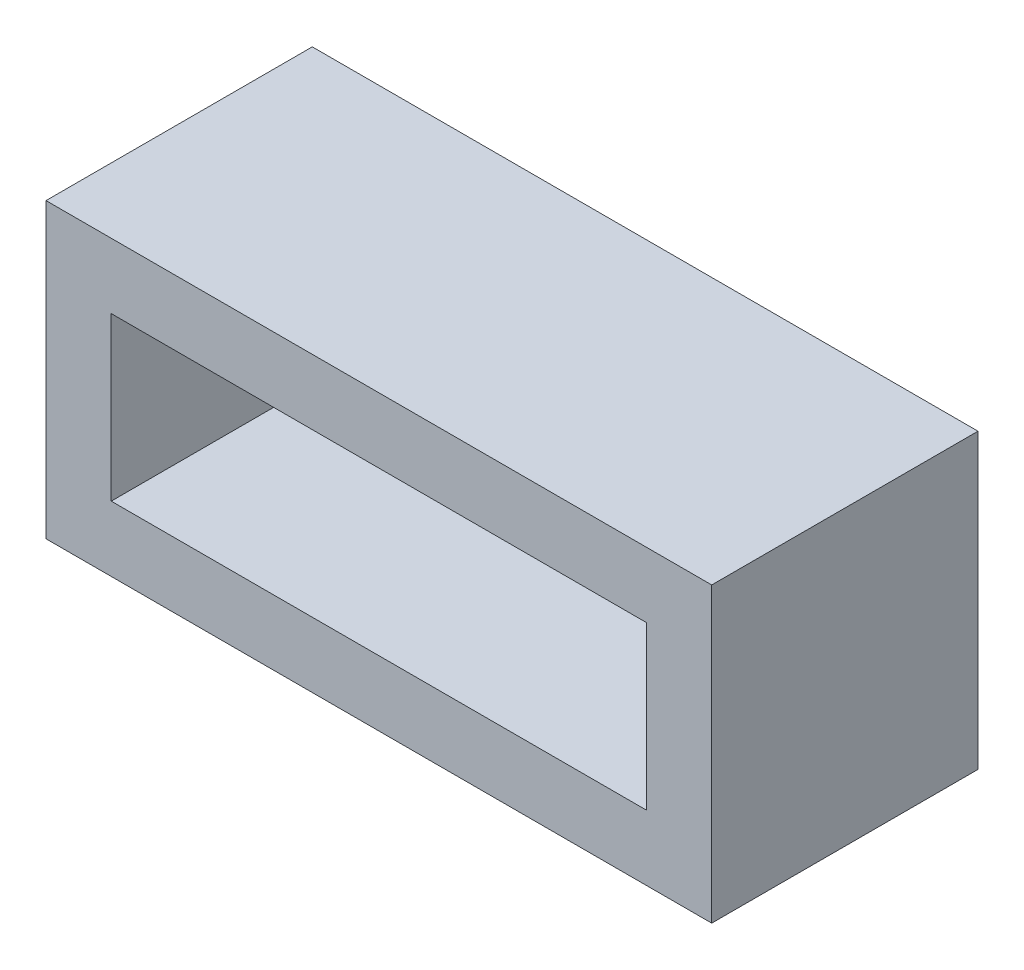
ISO-10303-21;
HEADER;
FILE_DESCRIPTION(('STEP AP214'),'2;1');
FILE_NAME('part.step','',(''),(''),'','','');
FILE_SCHEMA(('AUTOMOTIVE_DESIGN { 1 0 10303 214 1 1 1 1 }'));
ENDSEC;
DATA;
#1=APPLICATION_CONTEXT('core data for automotive mechanical design processes');
#2=APPLICATION_PROTOCOL_DEFINITION('international standard','automotive_design',2000,#1);
#3=PRODUCT_CONTEXT('',#1,'mechanical');
#4=PRODUCT('Part','Part','',(#3));
#5=PRODUCT_RELATED_PRODUCT_CATEGORY('part','',(#4));
#6=PRODUCT_DEFINITION_FORMATION('','',#4);
#7=PRODUCT_DEFINITION_CONTEXT('part definition',#1,'design');
#8=PRODUCT_DEFINITION('design','',#6,#7);
#9=PRODUCT_DEFINITION_SHAPE('','',#8);
#10=(LENGTH_UNIT() NAMED_UNIT(*) SI_UNIT(.MILLI.,.METRE.));
#11=(NAMED_UNIT(*) PLANE_ANGLE_UNIT() SI_UNIT($,.RADIAN.));
#12=(NAMED_UNIT(*) SI_UNIT($,.STERADIAN.) SOLID_ANGLE_UNIT());
#13=UNCERTAINTY_MEASURE_WITH_UNIT(LENGTH_MEASURE(1.E-05),#10,'distance_accuracy_value','');
#14=(GEOMETRIC_REPRESENTATION_CONTEXT(3) GLOBAL_UNCERTAINTY_ASSIGNED_CONTEXT((#13)) GLOBAL_UNIT_ASSIGNED_CONTEXT((#10,
#11,#12)) REPRESENTATION_CONTEXT('',''));
#15=CARTESIAN_POINT('',(0.,0.,0.));
#16=DIRECTION('',(0.,0.,1.));
#17=DIRECTION('',(1.,0.,0.));
#18=AXIS2_PLACEMENT_3D('',#15,#16,#17);
#19=CARTESIAN_POINT('',(0.,0.,10.));
#20=DIRECTION('',(0.,0.,-1.));
#21=DIRECTION('',(-1.,0.,0.));
#22=AXIS2_PLACEMENT_3D('',#19,#20,#21);
#23=PLANE('',#22);
#24=DIRECTION('',(0.,1.,0.));
#25=VECTOR('',#24,1.);
#26=CARTESIAN_POINT('',(12.5,-5.5,10.));
#27=LINE('',#26,#25);
#28=CARTESIAN_POINT('',(12.5,-5.5,10.));
#29=VERTEX_POINT('',#28);
#30=CARTESIAN_POINT('',(12.5,5.5,10.));
#31=VERTEX_POINT('',#30);
#32=EDGE_CURVE('E140',#29,#31,#27,.T.);
#33=ORIENTED_EDGE('',*,*,#32,.T.);
#34=DIRECTION('',(-1.,0.,0.));
#35=VECTOR('',#34,1.);
#36=CARTESIAN_POINT('',(-12.5,5.5,10.));
#37=LINE('',#36,#35);
#38=CARTESIAN_POINT('',(-12.5,5.5,10.));
#39=VERTEX_POINT('',#38);
#40=EDGE_CURVE('E143',#31,#39,#37,.T.);
#41=ORIENTED_EDGE('',*,*,#40,.T.);
#42=DIRECTION('',(0.,-1.,0.));
#43=VECTOR('',#42,1.);
#44=CARTESIAN_POINT('',(-12.5,-5.5,10.));
#45=LINE('',#44,#43);
#46=CARTESIAN_POINT('',(-12.5,-5.5,10.));
#47=VERTEX_POINT('',#46);
#48=EDGE_CURVE('E146',#39,#47,#45,.T.);
#49=ORIENTED_EDGE('',*,*,#48,.T.);
#50=DIRECTION('',(1.,0.,0.));
#51=VECTOR('',#50,1.);
#52=CARTESIAN_POINT('',(-12.5,-5.5,10.));
#53=LINE('',#52,#51);
#54=EDGE_CURVE('E148',#47,#29,#53,.T.);
#55=ORIENTED_EDGE('',*,*,#54,.T.);
#56=EDGE_LOOP('',(#33,#41,#49,#55));
#57=FACE_BOUND('',#56,.T.);
#58=DIRECTION('',(0.,1.,0.));
#59=VECTOR('',#58,1.);
#60=CARTESIAN_POINT('',(10.05,-3.05,10.));
#61=LINE('',#60,#59);
#62=CARTESIAN_POINT('',(10.05,-3.05,10.));
#63=VERTEX_POINT('',#62);
#64=CARTESIAN_POINT('',(10.05,3.05,10.));
#65=VERTEX_POINT('',#64);
#66=EDGE_CURVE('E104',#63,#65,#61,.T.);
#67=ORIENTED_EDGE('',*,*,#66,.F.);
#68=DIRECTION('',(1.,0.,0.));
#69=VECTOR('',#68,1.);
#70=CARTESIAN_POINT('',(-10.05,-3.05,10.));
#71=LINE('',#70,#69);
#72=CARTESIAN_POINT('',(-10.05,-3.05,10.));
#73=VERTEX_POINT('',#72);
#74=EDGE_CURVE('E126',#73,#63,#71,.T.);
#75=ORIENTED_EDGE('',*,*,#74,.F.);
#76=DIRECTION('',(0.,-1.,0.));
#77=VECTOR('',#76,1.);
#78=CARTESIAN_POINT('',(-10.05,-3.05,10.));
#79=LINE('',#78,#77);
#80=CARTESIAN_POINT('',(-10.05,3.05,10.));
#81=VERTEX_POINT('',#80);
#82=EDGE_CURVE('E124',#81,#73,#79,.T.);
#83=ORIENTED_EDGE('',*,*,#82,.F.);
#84=DIRECTION('',(-1.,0.,0.));
#85=VECTOR('',#84,1.);
#86=CARTESIAN_POINT('',(-10.05,3.05,10.));
#87=LINE('',#86,#85);
#88=EDGE_CURVE('E112',#65,#81,#87,.T.);
#89=ORIENTED_EDGE('',*,*,#88,.F.);
#90=EDGE_LOOP('',(#67,#75,#83,#89));
#91=FACE_BOUND('',#90,.T.);
#92=ADVANCED_FACE('F39',(#57,#91),#23,.F.);
#93=CARTESIAN_POINT('',(0.,0.,0.));
#94=DIRECTION('',(0.,0.,-1.));
#95=DIRECTION('',(-1.,0.,0.));
#96=AXIS2_PLACEMENT_3D('',#93,#94,#95);
#97=PLANE('',#96);
#98=DIRECTION('',(0.,1.,0.));
#99=VECTOR('',#98,1.);
#100=CARTESIAN_POINT('',(12.5,-5.5,0.));
#101=LINE('',#100,#99);
#102=CARTESIAN_POINT('',(12.5,-5.5,0.));
#103=VERTEX_POINT('',#102);
#104=CARTESIAN_POINT('',(12.5,5.5,0.));
#105=VERTEX_POINT('',#104);
#106=EDGE_CURVE('E120',#103,#105,#101,.T.);
#107=ORIENTED_EDGE('',*,*,#106,.F.);
#108=DIRECTION('',(1.,0.,0.));
#109=VECTOR('',#108,1.);
#110=CARTESIAN_POINT('',(-12.5,-5.5,0.));
#111=LINE('',#110,#109);
#112=CARTESIAN_POINT('',(-12.5,-5.5,0.));
#113=VERTEX_POINT('',#112);
#114=EDGE_CURVE('E144',#113,#103,#111,.T.);
#115=ORIENTED_EDGE('',*,*,#114,.F.);
#116=DIRECTION('',(0.,-1.,0.));
#117=VECTOR('',#116,1.);
#118=CARTESIAN_POINT('',(-12.5,-5.5,0.));
#119=LINE('',#118,#117);
#120=CARTESIAN_POINT('',(-12.5,5.5,0.));
#121=VERTEX_POINT('',#120);
#122=EDGE_CURVE('E155',#121,#113,#119,.T.);
#123=ORIENTED_EDGE('',*,*,#122,.F.);
#124=DIRECTION('',(-1.,0.,0.));
#125=VECTOR('',#124,1.);
#126=CARTESIAN_POINT('',(-12.5,5.5,0.));
#127=LINE('',#126,#125);
#128=EDGE_CURVE('E153',#105,#121,#127,.T.);
#129=ORIENTED_EDGE('',*,*,#128,.F.);
#130=EDGE_LOOP('',(#107,#115,#123,#129));
#131=FACE_BOUND('',#130,.T.);
#132=DIRECTION('',(1.,0.,0.));
#133=VECTOR('',#132,1.);
#134=CARTESIAN_POINT('',(-10.05,-3.05,0.));
#135=LINE('',#134,#133);
#136=CARTESIAN_POINT('',(-10.05,-3.05,0.));
#137=VERTEX_POINT('',#136);
#138=CARTESIAN_POINT('',(10.05,-3.05,0.));
#139=VERTEX_POINT('',#138);
#140=EDGE_CURVE('E113',#137,#139,#135,.T.);
#141=ORIENTED_EDGE('',*,*,#140,.T.);
#142=DIRECTION('',(0.,1.,0.));
#143=VECTOR('',#142,1.);
#144=CARTESIAN_POINT('',(10.05,-3.05,0.));
#145=LINE('',#144,#143);
#146=CARTESIAN_POINT('',(10.05,3.05,0.));
#147=VERTEX_POINT('',#146);
#148=EDGE_CURVE('E62',#139,#147,#145,.T.);
#149=ORIENTED_EDGE('',*,*,#148,.T.);
#150=DIRECTION('',(-1.,0.,0.));
#151=VECTOR('',#150,1.);
#152=CARTESIAN_POINT('',(-10.05,3.05,0.));
#153=LINE('',#152,#151);
#154=CARTESIAN_POINT('',(-10.05,3.05,0.));
#155=VERTEX_POINT('',#154);
#156=EDGE_CURVE('E119',#147,#155,#153,.T.);
#157=ORIENTED_EDGE('',*,*,#156,.T.);
#158=DIRECTION('',(0.,-1.,0.));
#159=VECTOR('',#158,1.);
#160=CARTESIAN_POINT('',(-10.05,-3.05,0.));
#161=LINE('',#160,#159);
#162=EDGE_CURVE('E132',#155,#137,#161,.T.);
#163=ORIENTED_EDGE('',*,*,#162,.T.);
#164=EDGE_LOOP('',(#141,#149,#157,#163));
#165=FACE_BOUND('',#164,.T.);
#166=ADVANCED_FACE('F173',(#131,#165),#97,.T.);
#167=CARTESIAN_POINT('',(12.5,-5.5,10.));
#168=DIRECTION('',(-1.,0.,0.));
#169=DIRECTION('',(0.,0.,1.));
#170=AXIS2_PLACEMENT_3D('',#167,#168,#169);
#171=PLANE('',#170);
#172=ORIENTED_EDGE('',*,*,#106,.T.);
#173=DIRECTION('',(0.,0.,-1.));
#174=VECTOR('',#173,1.);
#175=CARTESIAN_POINT('',(12.5,5.5,10.));
#176=LINE('',#175,#174);
#177=EDGE_CURVE('E11',#31,#105,#176,.T.);
#178=ORIENTED_EDGE('',*,*,#177,.F.);
#179=ORIENTED_EDGE('',*,*,#32,.F.);
#180=DIRECTION('',(0.,0.,-1.));
#181=VECTOR('',#180,1.);
#182=CARTESIAN_POINT('',(12.5,-5.5,10.));
#183=LINE('',#182,#181);
#184=EDGE_CURVE('E150',#29,#103,#183,.T.);
#185=ORIENTED_EDGE('',*,*,#184,.T.);
#186=EDGE_LOOP('',(#172,#178,#179,#185));
#187=FACE_BOUND('',#186,.T.);
#188=ADVANCED_FACE('F41',(#187),#171,.F.);
#189=CARTESIAN_POINT('',(-12.5,5.5,10.));
#190=DIRECTION('',(0.,-1.,0.));
#191=DIRECTION('',(0.,0.,-1.));
#192=AXIS2_PLACEMENT_3D('',#189,#190,#191);
#193=PLANE('',#192);
#194=ORIENTED_EDGE('',*,*,#128,.T.);
#195=DIRECTION('',(0.,0.,-1.));
#196=VECTOR('',#195,1.);
#197=CARTESIAN_POINT('',(-12.5,5.5,10.));
#198=LINE('',#197,#196);
#199=EDGE_CURVE('E47',#39,#121,#198,.T.);
#200=ORIENTED_EDGE('',*,*,#199,.F.);
#201=ORIENTED_EDGE('',*,*,#40,.F.);
#202=ORIENTED_EDGE('',*,*,#177,.T.);
#203=EDGE_LOOP('',(#194,#200,#201,#202));
#204=FACE_BOUND('',#203,.T.);
#205=ADVANCED_FACE('F183',(#204),#193,.F.);
#206=CARTESIAN_POINT('',(-12.5,-5.5,10.));
#207=DIRECTION('',(1.,0.,0.));
#208=DIRECTION('',(0.,0.,-1.));
#209=AXIS2_PLACEMENT_3D('',#206,#207,#208);
#210=PLANE('',#209);
#211=ORIENTED_EDGE('',*,*,#122,.T.);
#212=DIRECTION('',(0.,0.,-1.));
#213=VECTOR('',#212,1.);
#214=CARTESIAN_POINT('',(-12.5,-5.5,10.));
#215=LINE('',#214,#213);
#216=EDGE_CURVE('E160',#47,#113,#215,.T.);
#217=ORIENTED_EDGE('',*,*,#216,.F.);
#218=ORIENTED_EDGE('',*,*,#48,.F.);
#219=ORIENTED_EDGE('',*,*,#199,.T.);
#220=EDGE_LOOP('',(#211,#217,#218,#219));
#221=FACE_BOUND('',#220,.T.);
#222=ADVANCED_FACE('F167',(#221),#210,.F.);
#223=CARTESIAN_POINT('',(-12.5,-5.5,10.));
#224=DIRECTION('',(0.,1.,0.));
#225=DIRECTION('',(0.,0.,1.));
#226=AXIS2_PLACEMENT_3D('',#223,#224,#225);
#227=PLANE('',#226);
#228=ORIENTED_EDGE('',*,*,#114,.T.);
#229=ORIENTED_EDGE('',*,*,#184,.F.);
#230=ORIENTED_EDGE('',*,*,#54,.F.);
#231=ORIENTED_EDGE('',*,*,#216,.T.);
#232=EDGE_LOOP('',(#228,#229,#230,#231));
#233=FACE_BOUND('',#232,.T.);
#234=ADVANCED_FACE('F177',(#233),#227,.F.);
#235=CARTESIAN_POINT('',(10.05,-3.05,10.));
#236=DIRECTION('',(-1.,0.,0.));
#237=DIRECTION('',(0.,0.,1.));
#238=AXIS2_PLACEMENT_3D('',#235,#236,#237);
#239=PLANE('',#238);
#240=ORIENTED_EDGE('',*,*,#148,.F.);
#241=DIRECTION('',(0.,0.,-1.));
#242=VECTOR('',#241,1.);
#243=CARTESIAN_POINT('',(10.05,-3.05,10.));
#244=LINE('',#243,#242);
#245=EDGE_CURVE('E108',#63,#139,#244,.T.);
#246=ORIENTED_EDGE('',*,*,#245,.F.);
#247=ORIENTED_EDGE('',*,*,#66,.T.);
#248=DIRECTION('',(0.,0.,-1.));
#249=VECTOR('',#248,1.);
#250=CARTESIAN_POINT('',(10.05,3.05,10.));
#251=LINE('',#250,#249);
#252=EDGE_CURVE('E107',#65,#147,#251,.T.);
#253=ORIENTED_EDGE('',*,*,#252,.T.);
#254=EDGE_LOOP('',(#240,#246,#247,#253));
#255=FACE_BOUND('',#254,.T.);
#256=ADVANCED_FACE('F106',(#255),#239,.T.);
#257=CARTESIAN_POINT('',(-10.05,3.05,10.));
#258=DIRECTION('',(0.,-1.,0.));
#259=DIRECTION('',(0.,0.,-1.));
#260=AXIS2_PLACEMENT_3D('',#257,#258,#259);
#261=PLANE('',#260);
#262=ORIENTED_EDGE('',*,*,#156,.F.);
#263=ORIENTED_EDGE('',*,*,#252,.F.);
#264=ORIENTED_EDGE('',*,*,#88,.T.);
#265=DIRECTION('',(0.,0.,-1.));
#266=VECTOR('',#265,1.);
#267=CARTESIAN_POINT('',(-10.05,3.05,10.));
#268=LINE('',#267,#266);
#269=EDGE_CURVE('E121',#81,#155,#268,.T.);
#270=ORIENTED_EDGE('',*,*,#269,.T.);
#271=EDGE_LOOP('',(#262,#263,#264,#270));
#272=FACE_BOUND('',#271,.T.);
#273=ADVANCED_FACE('F116',(#272),#261,.T.);
#274=CARTESIAN_POINT('',(-10.05,-3.05,10.));
#275=DIRECTION('',(1.,0.,0.));
#276=DIRECTION('',(0.,0.,-1.));
#277=AXIS2_PLACEMENT_3D('',#274,#275,#276);
#278=PLANE('',#277);
#279=ORIENTED_EDGE('',*,*,#162,.F.);
#280=ORIENTED_EDGE('',*,*,#269,.F.);
#281=ORIENTED_EDGE('',*,*,#82,.T.);
#282=DIRECTION('',(0.,0.,-1.));
#283=VECTOR('',#282,1.);
#284=CARTESIAN_POINT('',(-10.05,-3.05,10.));
#285=LINE('',#284,#283);
#286=EDGE_CURVE('E54',#73,#137,#285,.T.);
#287=ORIENTED_EDGE('',*,*,#286,.T.);
#288=EDGE_LOOP('',(#279,#280,#281,#287));
#289=FACE_BOUND('',#288,.T.);
#290=ADVANCED_FACE('F206',(#289),#278,.T.);
#291=CARTESIAN_POINT('',(-10.05,-3.05,10.));
#292=DIRECTION('',(0.,1.,0.));
#293=DIRECTION('',(0.,0.,1.));
#294=AXIS2_PLACEMENT_3D('',#291,#292,#293);
#295=PLANE('',#294);
#296=ORIENTED_EDGE('',*,*,#140,.F.);
#297=ORIENTED_EDGE('',*,*,#286,.F.);
#298=ORIENTED_EDGE('',*,*,#74,.T.);
#299=ORIENTED_EDGE('',*,*,#245,.T.);
#300=EDGE_LOOP('',(#296,#297,#298,#299));
#301=FACE_BOUND('',#300,.T.);
#302=ADVANCED_FACE('F210',(#301),#295,.T.);
#303=CLOSED_SHELL('',(#92,#166,#188,#205,#222,#234,#256,#273,#290,#302));
#304=MANIFOLD_SOLID_BREP('B2',#303);
#305=ADVANCED_BREP_SHAPE_REPRESENTATION('',(#18,#304),#14);
#306=SHAPE_DEFINITION_REPRESENTATION(#9,#305);
ENDSEC;
END-ISO-10303-21;
